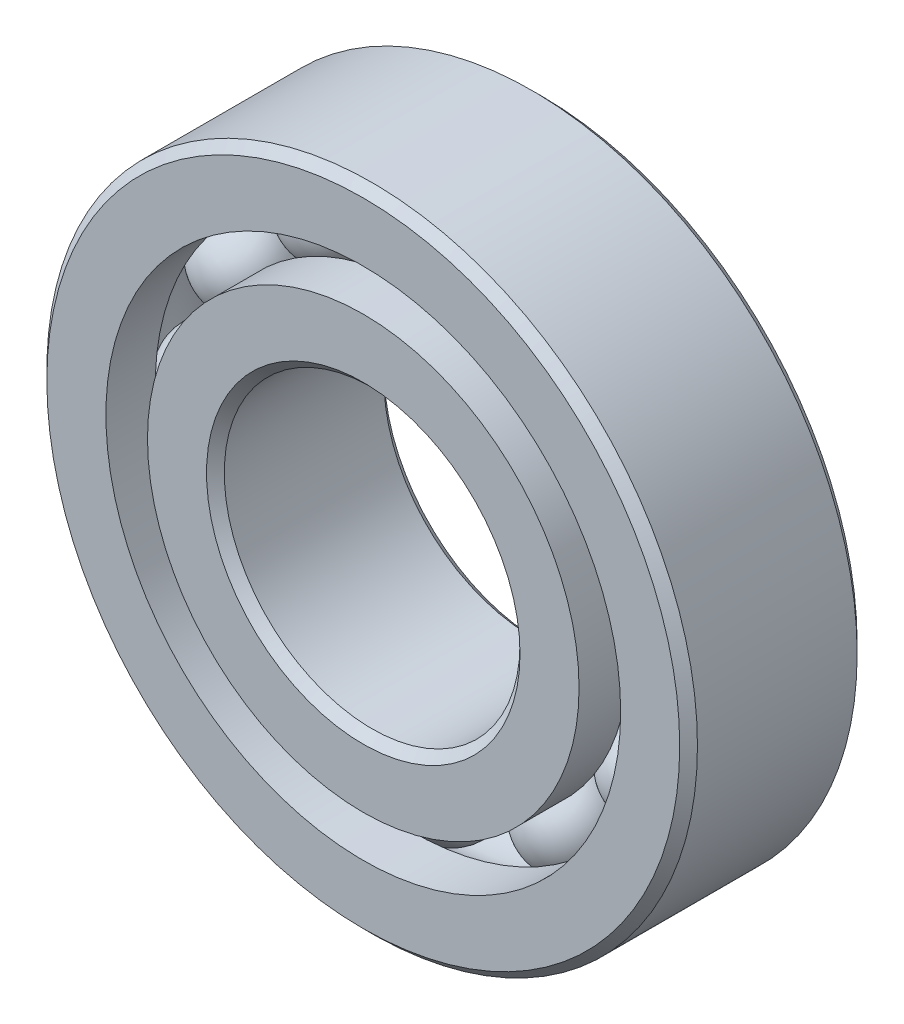
ISO-10303-21;
HEADER;
FILE_DESCRIPTION(('STEP AP214'),'2;1');
FILE_NAME('part.step','',(''),(''),'','','');
FILE_SCHEMA(('AUTOMOTIVE_DESIGN { 1 0 10303 214 1 1 1 1 }'));
ENDSEC;
DATA;
#1=APPLICATION_CONTEXT('core data for automotive mechanical design processes');
#2=APPLICATION_PROTOCOL_DEFINITION('international standard','automotive_design',2000,#1);
#3=PRODUCT_CONTEXT('',#1,'mechanical');
#4=PRODUCT('Part','Part','',(#3));
#5=PRODUCT_RELATED_PRODUCT_CATEGORY('part','',(#4));
#6=PRODUCT_DEFINITION_FORMATION('','',#4);
#7=PRODUCT_DEFINITION_CONTEXT('part definition',#1,'design');
#8=PRODUCT_DEFINITION('design','',#6,#7);
#9=PRODUCT_DEFINITION_SHAPE('','',#8);
#10=(LENGTH_UNIT() NAMED_UNIT(*) SI_UNIT(.MILLI.,.METRE.));
#11=(NAMED_UNIT(*) PLANE_ANGLE_UNIT() SI_UNIT($,.RADIAN.));
#12=(NAMED_UNIT(*) SI_UNIT($,.STERADIAN.) SOLID_ANGLE_UNIT());
#13=UNCERTAINTY_MEASURE_WITH_UNIT(LENGTH_MEASURE(1.E-05),#10,'distance_accuracy_value','');
#14=(GEOMETRIC_REPRESENTATION_CONTEXT(3) GLOBAL_UNCERTAINTY_ASSIGNED_CONTEXT((#13)) GLOBAL_UNIT_ASSIGNED_CONTEXT((#10,
#11,#12)) REPRESENTATION_CONTEXT('',''));
#15=CARTESIAN_POINT('',(0.,0.,0.));
#16=DIRECTION('',(0.,0.,1.));
#17=DIRECTION('',(1.,0.,0.));
#18=AXIS2_PLACEMENT_3D('',#15,#16,#17);
#19=CARTESIAN_POINT('',(-3.99999999999991,6.92820323027556,0.));
#20=DIRECTION('',(0.,0.,1.));
#21=DIRECTION('',(-0.499999999999989,0.866025403784445,0.));
#22=AXIS2_PLACEMENT_3D('',#19,#20,#21);
#23=SPHERICAL_SURFACE('',#22,1.50744951180654);
#24=CARTESIAN_POINT('',(-3.99999999999991,6.92820323027556,1.50744951180654));
#25=VERTEX_POINT('',#24);
#26=VERTEX_LOOP('',#25);
#27=FACE_BOUND('',#26,.T.);
#28=ADVANCED_FACE('F39',(#27),#23,.T.);
#29=CLOSED_SHELL('',(#28));
#30=MANIFOLD_SOLID_BREP('B2',#29);
#31=CARTESIAN_POINT('',(-6.92820323027546,4.00000000000008,0.));
#32=DIRECTION('',(0.,0.,1.));
#33=DIRECTION('',(-0.866025403784433,0.50000000000001,0.));
#34=AXIS2_PLACEMENT_3D('',#31,#32,#33);
#35=SPHERICAL_SURFACE('',#34,1.50744951180654);
#36=CARTESIAN_POINT('',(-6.92820323027546,4.00000000000008,1.50744951180654));
#37=VERTEX_POINT('',#36);
#38=VERTEX_LOOP('',#37);
#39=FACE_BOUND('',#38,.T.);
#40=ADVANCED_FACE('F59',(#39),#35,.T.);
#41=CLOSED_SHELL('',(#40));
#42=MANIFOLD_SOLID_BREP('B6',#41);
#43=CARTESIAN_POINT('',(-8.,0.,0.));
#44=DIRECTION('',(0.,0.,1.));
#45=DIRECTION('',(-1.,0.,0.));
#46=AXIS2_PLACEMENT_3D('',#43,#44,#45);
#47=SPHERICAL_SURFACE('',#46,1.50744951180654);
#48=CARTESIAN_POINT('',(-8.,0.,1.50744951180654));
#49=VERTEX_POINT('',#48);
#50=VERTEX_LOOP('',#49);
#51=FACE_BOUND('',#50,.T.);
#52=ADVANCED_FACE('F79',(#51),#47,.T.);
#53=CLOSED_SHELL('',(#52));
#54=MANIFOLD_SOLID_BREP('B35',#53);
#55=CARTESIAN_POINT('',(-6.92820323027555,-3.99999999999994,0.));
#56=DIRECTION('',(0.,0.,1.));
#57=DIRECTION('',(-0.866025403784443,-0.499999999999992,0.));
#58=AXIS2_PLACEMENT_3D('',#55,#56,#57);
#59=SPHERICAL_SURFACE('',#58,1.50744951180654);
#60=CARTESIAN_POINT('',(-6.92820323027555,-3.99999999999994,1.50744951180654));
#61=VERTEX_POINT('',#60);
#62=VERTEX_LOOP('',#61);
#63=FACE_BOUND('',#62,.T.);
#64=ADVANCED_FACE('F99',(#63),#59,.T.);
#65=CLOSED_SHELL('',(#64));
#66=MANIFOLD_SOLID_BREP('B55',#65);
#67=CARTESIAN_POINT('',(-4.00000000000006,-6.92820323027548,0.));
#68=DIRECTION('',(0.,0.,1.));
#69=DIRECTION('',(-0.500000000000007,-0.866025403784435,0.));
#70=AXIS2_PLACEMENT_3D('',#67,#68,#69);
#71=SPHERICAL_SURFACE('',#70,1.50744951180654);
#72=CARTESIAN_POINT('',(-4.00000000000006,-6.92820323027548,1.50744951180654));
#73=VERTEX_POINT('',#72);
#74=VERTEX_LOOP('',#73);
#75=FACE_BOUND('',#74,.T.);
#76=ADVANCED_FACE('F119',(#75),#71,.T.);
#77=CLOSED_SHELL('',(#76));
#78=MANIFOLD_SOLID_BREP('B75',#77);
#79=CARTESIAN_POINT('',(0.,-8.,0.));
#80=DIRECTION('',(0.,0.,1.));
#81=DIRECTION('',(0.,-1.,0.));
#82=AXIS2_PLACEMENT_3D('',#79,#80,#81);
#83=SPHERICAL_SURFACE('',#82,1.50744951180654);
#84=CARTESIAN_POINT('',(0.,-8.,1.50744951180654));
#85=VERTEX_POINT('',#84);
#86=VERTEX_LOOP('',#85);
#87=FACE_BOUND('',#86,.T.);
#88=ADVANCED_FACE('F139',(#87),#83,.T.);
#89=CLOSED_SHELL('',(#88));
#90=MANIFOLD_SOLID_BREP('B95',#89);
#91=CARTESIAN_POINT('',(3.99999999999996,-6.92820323027553,0.));
#92=DIRECTION('',(0.,0.,1.));
#93=DIRECTION('',(0.499999999999995,-0.866025403784442,0.));
#94=AXIS2_PLACEMENT_3D('',#91,#92,#93);
#95=SPHERICAL_SURFACE('',#94,1.50744951180654);
#96=CARTESIAN_POINT('',(3.99999999999996,-6.92820323027553,1.50744951180654));
#97=VERTEX_POINT('',#96);
#98=VERTEX_LOOP('',#97);
#99=FACE_BOUND('',#98,.T.);
#100=ADVANCED_FACE('F159',(#99),#95,.T.);
#101=CLOSED_SHELL('',(#100));
#102=MANIFOLD_SOLID_BREP('B115',#101);
#103=CARTESIAN_POINT('',(6.92820323027549,-4.00000000000003,0.));
#104=DIRECTION('',(0.,0.,1.));
#105=DIRECTION('',(0.866025403784436,-0.500000000000004,0.));
#106=AXIS2_PLACEMENT_3D('',#103,#104,#105);
#107=SPHERICAL_SURFACE('',#106,1.50744951180654);
#108=CARTESIAN_POINT('',(6.92820323027549,-4.00000000000003,1.50744951180654));
#109=VERTEX_POINT('',#108);
#110=VERTEX_LOOP('',#109);
#111=FACE_BOUND('',#110,.T.);
#112=ADVANCED_FACE('F179',(#111),#107,.T.);
#113=CLOSED_SHELL('',(#112));
#114=MANIFOLD_SOLID_BREP('B135',#113);
#115=CARTESIAN_POINT('',(8.,0.,0.));
#116=DIRECTION('',(0.,0.,1.));
#117=DIRECTION('',(1.,0.,0.));
#118=AXIS2_PLACEMENT_3D('',#115,#116,#117);
#119=SPHERICAL_SURFACE('',#118,1.50744951180654);
#120=CARTESIAN_POINT('',(8.,0.,1.50744951180654));
#121=VERTEX_POINT('',#120);
#122=VERTEX_LOOP('',#121);
#123=FACE_BOUND('',#122,.T.);
#124=ADVANCED_FACE('F199',(#123),#119,.T.);
#125=CLOSED_SHELL('',(#124));
#126=MANIFOLD_SOLID_BREP('B155',#125);
#127=CARTESIAN_POINT('',(6.92820323027552,3.99999999999998,0.));
#128=DIRECTION('',(0.,0.,1.));
#129=DIRECTION('',(0.86602540378444,0.499999999999998,0.));
#130=AXIS2_PLACEMENT_3D('',#127,#128,#129);
#131=SPHERICAL_SURFACE('',#130,1.50744951180654);
#132=CARTESIAN_POINT('',(6.92820323027552,3.99999999999998,1.50744951180654));
#133=VERTEX_POINT('',#132);
#134=VERTEX_LOOP('',#133);
#135=FACE_BOUND('',#134,.T.);
#136=ADVANCED_FACE('F219',(#135),#131,.T.);
#137=CLOSED_SHELL('',(#136));
#138=MANIFOLD_SOLID_BREP('B175',#137);
#139=CARTESIAN_POINT('',(4.00000000000001,6.9282032302755,0.));
#140=DIRECTION('',(0.,0.,1.));
#141=DIRECTION('',(0.500000000000001,0.866025403784438,0.));
#142=AXIS2_PLACEMENT_3D('',#139,#140,#141);
#143=SPHERICAL_SURFACE('',#142,1.50744951180654);
#144=CARTESIAN_POINT('',(4.00000000000001,6.9282032302755,1.50744951180654));
#145=VERTEX_POINT('',#144);
#146=VERTEX_LOOP('',#145);
#147=FACE_BOUND('',#146,.T.);
#148=ADVANCED_FACE('F239',(#147),#143,.T.);
#149=CLOSED_SHELL('',(#148));
#150=MANIFOLD_SOLID_BREP('B195',#149);
#151=CARTESIAN_POINT('',(0.,8.,0.));
#152=DIRECTION('',(0.,0.,1.));
#153=DIRECTION('',(0.,1.,0.));
#154=AXIS2_PLACEMENT_3D('',#151,#152,#153);
#155=SPHERICAL_SURFACE('',#154,1.50744951180654);
#156=CARTESIAN_POINT('',(0.,8.,1.50744951180654));
#157=VERTEX_POINT('',#156);
#158=VERTEX_LOOP('',#157);
#159=FACE_BOUND('',#158,.T.);
#160=ADVANCED_FACE('F261',(#159),#155,.T.);
#161=CLOSED_SHELL('',(#160));
#162=MANIFOLD_SOLID_BREP('B215',#161);
#163=CARTESIAN_POINT('',(0.,7.2967032967033,3.));
#164=DIRECTION('',(0.,0.,-1.));
#165=DIRECTION('',(-1.,0.,0.));
#166=AXIS2_PLACEMENT_3D('',#163,#164,#165);
#167=PLANE('',#166);
#168=CARTESIAN_POINT('',(0.,0.,3.));
#169=DIRECTION('',(0.,0.,1.));
#170=DIRECTION('',(1.,0.,0.));
#171=AXIS2_PLACEMENT_3D('',#168,#169,#170);
#172=CIRCLE('',#171,5.3);
#173=CARTESIAN_POINT('',(5.3,0.,3.));
#174=VERTEX_POINT('',#173);
#175=EDGE_CURVE('E308',#174,#174,#172,.T.);
#176=ORIENTED_EDGE('',*,*,#175,.F.);
#177=EDGE_LOOP('',(#176));
#178=FACE_BOUND('',#177,.T.);
#179=CARTESIAN_POINT('',(0.,0.,3.));
#180=DIRECTION('',(0.,0.,1.));
#181=DIRECTION('',(1.,0.,0.));
#182=AXIS2_PLACEMENT_3D('',#179,#180,#181);
#183=CIRCLE('',#182,7.2967032967033);
#184=CARTESIAN_POINT('',(7.2967032967033,0.,3.));
#185=VERTEX_POINT('',#184);
#186=EDGE_CURVE('E260',#185,#185,#183,.T.);
#187=ORIENTED_EDGE('',*,*,#186,.T.);
#188=EDGE_LOOP('',(#187));
#189=FACE_BOUND('',#188,.T.);
#190=ADVANCED_FACE('F280',(#178,#189),#167,.F.);
#191=CARTESIAN_POINT('',(0.,0.,3.));
#192=DIRECTION('',(0.,0.,1.));
#193=DIRECTION('',(1.,0.,0.));
#194=AXIS2_PLACEMENT_3D('',#191,#192,#193);
#195=CYLINDRICAL_SURFACE('',#194,7.2967032967033);
#196=ORIENTED_EDGE('',*,*,#186,.F.);
#197=EDGE_LOOP('',(#196));
#198=FACE_BOUND('',#197,.T.);
#199=CARTESIAN_POINT('',(0.,0.,1.33333333333333));
#200=DIRECTION('',(0.,0.,1.));
#201=DIRECTION('',(1.,0.,0.));
#202=AXIS2_PLACEMENT_3D('',#199,#200,#201);
#203=CIRCLE('',#202,7.2967032967033);
#204=CARTESIAN_POINT('',(7.2967032967033,0.,1.33333333333333));
#205=VERTEX_POINT('',#204);
#206=EDGE_CURVE('E286',#205,#205,#203,.T.);
#207=ORIENTED_EDGE('',*,*,#206,.T.);
#208=EDGE_LOOP('',(#207));
#209=FACE_BOUND('',#208,.T.);
#210=ADVANCED_FACE('F315',(#198,#209),#195,.T.);
#211=CARTESIAN_POINT('',(0.,0.,0.));
#212=DIRECTION('',(0.,0.,1.));
#213=DIRECTION('',(1.,0.,0.));
#214=AXIS2_PLACEMENT_3D('',#211,#212,#213);
#215=TOROIDAL_SURFACE('',#214,8.,1.50744951180654);
#216=ORIENTED_EDGE('',*,*,#206,.F.);
#217=EDGE_LOOP('',(#216));
#218=FACE_BOUND('',#217,.T.);
#219=CARTESIAN_POINT('',(0.,0.,-1.33333333333334));
#220=DIRECTION('',(0.,0.,1.));
#221=DIRECTION('',(1.,0.,0.));
#222=AXIS2_PLACEMENT_3D('',#219,#220,#221);
#223=CIRCLE('',#222,7.2967032967033);
#224=CARTESIAN_POINT('',(7.2967032967033,0.,-1.33333333333334));
#225=VERTEX_POINT('',#224);
#226=EDGE_CURVE('E290',#225,#225,#223,.T.);
#227=ORIENTED_EDGE('',*,*,#226,.T.);
#228=EDGE_LOOP('',(#227));
#229=FACE_BOUND('',#228,.T.);
#230=ADVANCED_FACE('F319',(#218,#229),#215,.F.);
#231=CARTESIAN_POINT('',(0.,0.,3.));
#232=DIRECTION('',(0.,0.,1.));
#233=DIRECTION('',(1.,0.,0.));
#234=AXIS2_PLACEMENT_3D('',#231,#232,#233);
#235=CYLINDRICAL_SURFACE('',#234,7.2967032967033);
#236=ORIENTED_EDGE('',*,*,#226,.F.);
#237=EDGE_LOOP('',(#236));
#238=FACE_BOUND('',#237,.T.);
#239=CARTESIAN_POINT('',(0.,0.,-3.));
#240=DIRECTION('',(0.,0.,1.));
#241=DIRECTION('',(1.,0.,0.));
#242=AXIS2_PLACEMENT_3D('',#239,#240,#241);
#243=CIRCLE('',#242,7.2967032967033);
#244=CARTESIAN_POINT('',(7.2967032967033,0.,-3.));
#245=VERTEX_POINT('',#244);
#246=EDGE_CURVE('E294',#245,#245,#243,.T.);
#247=ORIENTED_EDGE('',*,*,#246,.T.);
#248=EDGE_LOOP('',(#247));
#249=FACE_BOUND('',#248,.T.);
#250=ADVANCED_FACE('F324',(#238,#249),#235,.T.);
#251=CARTESIAN_POINT('',(0.,5.3,-3.));
#252=DIRECTION('',(0.,0.,1.));
#253=DIRECTION('',(1.,0.,0.));
#254=AXIS2_PLACEMENT_3D('',#251,#252,#253);
#255=PLANE('',#254);
#256=ORIENTED_EDGE('',*,*,#246,.F.);
#257=EDGE_LOOP('',(#256));
#258=FACE_BOUND('',#257,.T.);
#259=CARTESIAN_POINT('',(0.,0.,-3.));
#260=DIRECTION('',(0.,0.,1.));
#261=DIRECTION('',(1.,0.,0.));
#262=AXIS2_PLACEMENT_3D('',#259,#260,#261);
#263=CIRCLE('',#262,5.3);
#264=CARTESIAN_POINT('',(5.3,0.,-3.));
#265=VERTEX_POINT('',#264);
#266=EDGE_CURVE('E299',#265,#265,#263,.T.);
#267=ORIENTED_EDGE('',*,*,#266,.T.);
#268=EDGE_LOOP('',(#267));
#269=FACE_BOUND('',#268,.T.);
#270=ADVANCED_FACE('F330',(#258,#269),#255,.F.);
#271=CARTESIAN_POINT('',(0.,0.,-2.7));
#272=DIRECTION('',(0.,0.,-1.));
#273=DIRECTION('',(-1.,0.,0.));
#274=AXIS2_PLACEMENT_3D('',#271,#272,#273);
#275=CONICAL_SURFACE('',#274,5.,0.785398163397445);
#276=ORIENTED_EDGE('',*,*,#266,.F.);
#277=EDGE_LOOP('',(#276));
#278=FACE_BOUND('',#277,.T.);
#279=CARTESIAN_POINT('',(0.,0.,-2.7));
#280=DIRECTION('',(0.,0.,1.));
#281=DIRECTION('',(1.,0.,0.));
#282=AXIS2_PLACEMENT_3D('',#279,#280,#281);
#283=CIRCLE('',#282,5.);
#284=CARTESIAN_POINT('',(5.,0.,-2.7));
#285=VERTEX_POINT('',#284);
#286=EDGE_CURVE('E302',#285,#285,#283,.T.);
#287=ORIENTED_EDGE('',*,*,#286,.T.);
#288=EDGE_LOOP('',(#287));
#289=FACE_BOUND('',#288,.T.);
#290=ADVANCED_FACE('F334',(#278,#289),#275,.F.);
#291=CARTESIAN_POINT('',(0.,0.,3.));
#292=DIRECTION('',(0.,0.,1.));
#293=DIRECTION('',(1.,0.,0.));
#294=AXIS2_PLACEMENT_3D('',#291,#292,#293);
#295=CYLINDRICAL_SURFACE('',#294,5.);
#296=ORIENTED_EDGE('',*,*,#286,.F.);
#297=EDGE_LOOP('',(#296));
#298=FACE_BOUND('',#297,.T.);
#299=CARTESIAN_POINT('',(0.,0.,2.7));
#300=DIRECTION('',(0.,0.,1.));
#301=DIRECTION('',(1.,0.,0.));
#302=AXIS2_PLACEMENT_3D('',#299,#300,#301);
#303=CIRCLE('',#302,5.);
#304=CARTESIAN_POINT('',(5.,0.,2.7));
#305=VERTEX_POINT('',#304);
#306=EDGE_CURVE('E305',#305,#305,#303,.T.);
#307=ORIENTED_EDGE('',*,*,#306,.T.);
#308=EDGE_LOOP('',(#307));
#309=FACE_BOUND('',#308,.T.);
#310=ADVANCED_FACE('F338',(#298,#309),#295,.F.);
#311=CARTESIAN_POINT('',(0.,0.,3.));
#312=DIRECTION('',(0.,0.,1.));
#313=DIRECTION('',(1.,0.,0.));
#314=AXIS2_PLACEMENT_3D('',#311,#312,#313);
#315=CONICAL_SURFACE('',#314,5.3,0.785398163397451);
#316=ORIENTED_EDGE('',*,*,#306,.F.);
#317=EDGE_LOOP('',(#316));
#318=FACE_BOUND('',#317,.T.);
#319=ORIENTED_EDGE('',*,*,#175,.T.);
#320=EDGE_LOOP('',(#319));
#321=FACE_BOUND('',#320,.T.);
#322=ADVANCED_FACE('F312',(#318,#321),#315,.F.);
#323=CLOSED_SHELL('',(#190,#210,#230,#250,#270,#290,#310,#322));
#324=MANIFOLD_SOLID_BREP('B235',#323);
#325=CARTESIAN_POINT('',(0.,0.,2.7));
#326=DIRECTION('',(0.,0.,-1.));
#327=DIRECTION('',(-1.,0.,0.));
#328=AXIS2_PLACEMENT_3D('',#325,#326,#327);
#329=CONICAL_SURFACE('',#328,11.,0.785398163397446);
#330=CARTESIAN_POINT('',(0.,0.,3.));
#331=DIRECTION('',(0.,0.,1.));
#332=DIRECTION('',(1.,0.,0.));
#333=AXIS2_PLACEMENT_3D('',#330,#331,#332);
#334=CIRCLE('',#333,10.7);
#335=CARTESIAN_POINT('',(10.7,0.,3.));
#336=VERTEX_POINT('',#335);
#337=EDGE_CURVE('E429',#336,#336,#334,.T.);
#338=ORIENTED_EDGE('',*,*,#337,.F.);
#339=EDGE_LOOP('',(#338));
#340=FACE_BOUND('',#339,.T.);
#341=CARTESIAN_POINT('',(0.,0.,2.7));
#342=DIRECTION('',(0.,0.,1.));
#343=DIRECTION('',(1.,0.,0.));
#344=AXIS2_PLACEMENT_3D('',#341,#342,#343);
#345=CIRCLE('',#344,11.);
#346=CARTESIAN_POINT('',(11.,0.,2.7));
#347=VERTEX_POINT('',#346);
#348=EDGE_CURVE('E279',#347,#347,#345,.T.);
#349=ORIENTED_EDGE('',*,*,#348,.T.);
#350=EDGE_LOOP('',(#349));
#351=FACE_BOUND('',#350,.T.);
#352=ADVANCED_FACE('F401',(#340,#351),#329,.T.);
#353=CARTESIAN_POINT('',(0.,0.,3.));
#354=DIRECTION('',(0.,0.,1.));
#355=DIRECTION('',(1.,0.,0.));
#356=AXIS2_PLACEMENT_3D('',#353,#354,#355);
#357=CYLINDRICAL_SURFACE('',#356,11.);
#358=ORIENTED_EDGE('',*,*,#348,.F.);
#359=EDGE_LOOP('',(#358));
#360=FACE_BOUND('',#359,.T.);
#361=CARTESIAN_POINT('',(0.,0.,-2.7));
#362=DIRECTION('',(0.,0.,1.));
#363=DIRECTION('',(1.,0.,0.));
#364=AXIS2_PLACEMENT_3D('',#361,#362,#363);
#365=CIRCLE('',#364,11.);
#366=CARTESIAN_POINT('',(11.,0.,-2.7));
#367=VERTEX_POINT('',#366);
#368=EDGE_CURVE('E407',#367,#367,#365,.T.);
#369=ORIENTED_EDGE('',*,*,#368,.T.);
#370=EDGE_LOOP('',(#369));
#371=FACE_BOUND('',#370,.T.);
#372=ADVANCED_FACE('F436',(#360,#371),#357,.T.);
#373=CARTESIAN_POINT('',(0.,0.,-3.));
#374=DIRECTION('',(0.,0.,1.));
#375=DIRECTION('',(1.,0.,0.));
#376=AXIS2_PLACEMENT_3D('',#373,#374,#375);
#377=CONICAL_SURFACE('',#376,10.7,0.785398163397447);
#378=ORIENTED_EDGE('',*,*,#368,.F.);
#379=EDGE_LOOP('',(#378));
#380=FACE_BOUND('',#379,.T.);
#381=CARTESIAN_POINT('',(0.,0.,-3.));
#382=DIRECTION('',(0.,0.,1.));
#383=DIRECTION('',(1.,0.,0.));
#384=AXIS2_PLACEMENT_3D('',#381,#382,#383);
#385=CIRCLE('',#384,10.7);
#386=CARTESIAN_POINT('',(10.7,0.,-3.));
#387=VERTEX_POINT('',#386);
#388=EDGE_CURVE('E411',#387,#387,#385,.T.);
#389=ORIENTED_EDGE('',*,*,#388,.T.);
#390=EDGE_LOOP('',(#389));
#391=FACE_BOUND('',#390,.T.);
#392=ADVANCED_FACE('F440',(#380,#391),#377,.T.);
#393=CARTESIAN_POINT('',(0.,10.7,-3.));
#394=DIRECTION('',(0.,0.,1.));
#395=DIRECTION('',(1.,0.,0.));
#396=AXIS2_PLACEMENT_3D('',#393,#394,#395);
#397=PLANE('',#396);
#398=ORIENTED_EDGE('',*,*,#388,.F.);
#399=EDGE_LOOP('',(#398));
#400=FACE_BOUND('',#399,.T.);
#401=CARTESIAN_POINT('',(0.,0.,-3.));
#402=DIRECTION('',(0.,0.,1.));
#403=DIRECTION('',(1.,0.,0.));
#404=AXIS2_PLACEMENT_3D('',#401,#402,#403);
#405=CIRCLE('',#404,8.7032967032967);
#406=CARTESIAN_POINT('',(8.7032967032967,0.,-3.));
#407=VERTEX_POINT('',#406);
#408=EDGE_CURVE('E415',#407,#407,#405,.T.);
#409=ORIENTED_EDGE('',*,*,#408,.T.);
#410=EDGE_LOOP('',(#409));
#411=FACE_BOUND('',#410,.T.);
#412=ADVANCED_FACE('F445',(#400,#411),#397,.F.);
#413=CARTESIAN_POINT('',(0.,0.,3.));
#414=DIRECTION('',(0.,0.,1.));
#415=DIRECTION('',(1.,0.,0.));
#416=AXIS2_PLACEMENT_3D('',#413,#414,#415);
#417=CYLINDRICAL_SURFACE('',#416,8.7032967032967);
#418=ORIENTED_EDGE('',*,*,#408,.F.);
#419=EDGE_LOOP('',(#418));
#420=FACE_BOUND('',#419,.T.);
#421=CARTESIAN_POINT('',(0.,0.,-1.33333333333333));
#422=DIRECTION('',(0.,0.,1.));
#423=DIRECTION('',(1.,0.,0.));
#424=AXIS2_PLACEMENT_3D('',#421,#422,#423);
#425=CIRCLE('',#424,8.7032967032967);
#426=CARTESIAN_POINT('',(8.7032967032967,0.,-1.33333333333333));
#427=VERTEX_POINT('',#426);
#428=EDGE_CURVE('E420',#427,#427,#425,.T.);
#429=ORIENTED_EDGE('',*,*,#428,.T.);
#430=EDGE_LOOP('',(#429));
#431=FACE_BOUND('',#430,.T.);
#432=ADVANCED_FACE('F451',(#420,#431),#417,.F.);
#433=CARTESIAN_POINT('',(0.,0.,0.));
#434=DIRECTION('',(0.,0.,1.));
#435=DIRECTION('',(1.,0.,0.));
#436=AXIS2_PLACEMENT_3D('',#433,#434,#435);
#437=TOROIDAL_SURFACE('',#436,8.,1.50744951180654);
#438=ORIENTED_EDGE('',*,*,#428,.F.);
#439=EDGE_LOOP('',(#438));
#440=FACE_BOUND('',#439,.T.);
#441=CARTESIAN_POINT('',(0.,0.,1.33333333333333));
#442=DIRECTION('',(0.,0.,1.));
#443=DIRECTION('',(1.,0.,0.));
#444=AXIS2_PLACEMENT_3D('',#441,#442,#443);
#445=CIRCLE('',#444,8.7032967032967);
#446=CARTESIAN_POINT('',(8.7032967032967,0.,1.33333333333333));
#447=VERTEX_POINT('',#446);
#448=EDGE_CURVE('E423',#447,#447,#445,.T.);
#449=ORIENTED_EDGE('',*,*,#448,.T.);
#450=EDGE_LOOP('',(#449));
#451=FACE_BOUND('',#450,.T.);
#452=ADVANCED_FACE('F455',(#440,#451),#437,.F.);
#453=CARTESIAN_POINT('',(0.,0.,3.));
#454=DIRECTION('',(0.,0.,1.));
#455=DIRECTION('',(1.,0.,0.));
#456=AXIS2_PLACEMENT_3D('',#453,#454,#455);
#457=CYLINDRICAL_SURFACE('',#456,8.7032967032967);
#458=ORIENTED_EDGE('',*,*,#448,.F.);
#459=EDGE_LOOP('',(#458));
#460=FACE_BOUND('',#459,.T.);
#461=CARTESIAN_POINT('',(0.,0.,3.));
#462=DIRECTION('',(0.,0.,1.));
#463=DIRECTION('',(1.,0.,0.));
#464=AXIS2_PLACEMENT_3D('',#461,#462,#463);
#465=CIRCLE('',#464,8.7032967032967);
#466=CARTESIAN_POINT('',(8.7032967032967,0.,3.));
#467=VERTEX_POINT('',#466);
#468=EDGE_CURVE('E426',#467,#467,#465,.T.);
#469=ORIENTED_EDGE('',*,*,#468,.T.);
#470=EDGE_LOOP('',(#469));
#471=FACE_BOUND('',#470,.T.);
#472=ADVANCED_FACE('F459',(#460,#471),#457,.F.);
#473=CARTESIAN_POINT('',(0.,10.7,3.));
#474=DIRECTION('',(0.,0.,-1.));
#475=DIRECTION('',(-1.,0.,0.));
#476=AXIS2_PLACEMENT_3D('',#473,#474,#475);
#477=PLANE('',#476);
#478=ORIENTED_EDGE('',*,*,#468,.F.);
#479=EDGE_LOOP('',(#478));
#480=FACE_BOUND('',#479,.T.);
#481=ORIENTED_EDGE('',*,*,#337,.T.);
#482=EDGE_LOOP('',(#481));
#483=FACE_BOUND('',#482,.T.);
#484=ADVANCED_FACE('F433',(#480,#483),#477,.F.);
#485=CLOSED_SHELL('',(#352,#372,#392,#412,#432,#452,#472,#484));
#486=MANIFOLD_SOLID_BREP('B255',#485);
#487=ADVANCED_BREP_SHAPE_REPRESENTATION('',(#18,#30,#42,#54,#66,#78,#90,#102,#114,#126,#138,
#150,#162,#324,#486),#14);
#488=SHAPE_DEFINITION_REPRESENTATION(#9,#487);
ENDSEC;
END-ISO-10303-21;
